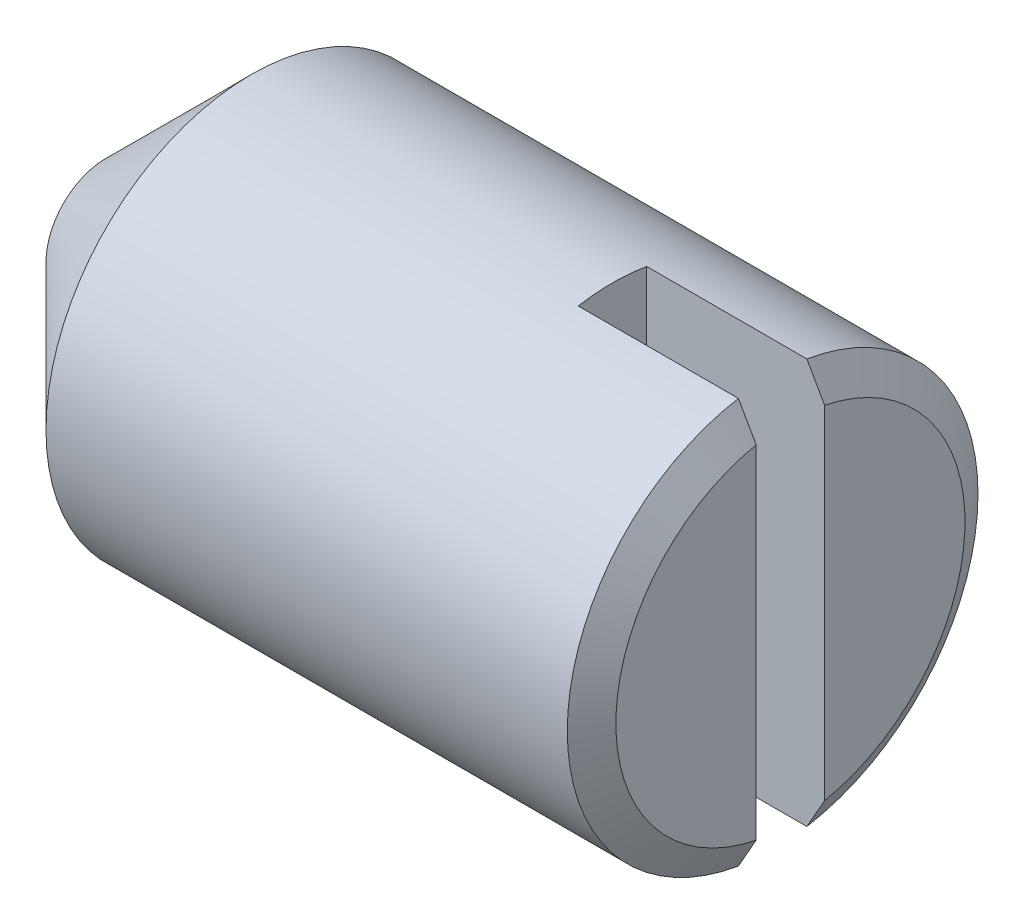
ISO-10303-21;
HEADER;
FILE_DESCRIPTION(('STEP AP214'),'2;1');
FILE_NAME('part.step','',(''),(''),'','','');
FILE_SCHEMA(('AUTOMOTIVE_DESIGN { 1 0 10303 214 1 1 1 1 }'));
ENDSEC;
DATA;
#1=APPLICATION_CONTEXT('core data for automotive mechanical design processes');
#2=APPLICATION_PROTOCOL_DEFINITION('international standard','automotive_design',2000,#1);
#3=PRODUCT_CONTEXT('',#1,'mechanical');
#4=PRODUCT('Part','Part','',(#3));
#5=PRODUCT_RELATED_PRODUCT_CATEGORY('part','',(#4));
#6=PRODUCT_DEFINITION_FORMATION('','',#4);
#7=PRODUCT_DEFINITION_CONTEXT('part definition',#1,'design');
#8=PRODUCT_DEFINITION('design','',#6,#7);
#9=PRODUCT_DEFINITION_SHAPE('','',#8);
#10=(LENGTH_UNIT() NAMED_UNIT(*) SI_UNIT(.MILLI.,.METRE.));
#11=(NAMED_UNIT(*) PLANE_ANGLE_UNIT() SI_UNIT($,.RADIAN.));
#12=(NAMED_UNIT(*) SI_UNIT($,.STERADIAN.) SOLID_ANGLE_UNIT());
#13=UNCERTAINTY_MEASURE_WITH_UNIT(LENGTH_MEASURE(1.E-05),#10,'distance_accuracy_value','');
#14=(GEOMETRIC_REPRESENTATION_CONTEXT(3) GLOBAL_UNCERTAINTY_ASSIGNED_CONTEXT((#13)) GLOBAL_UNIT_ASSIGNED_CONTEXT((#10,
#11,#12)) REPRESENTATION_CONTEXT('',''));
#15=CARTESIAN_POINT('',(0.,0.,0.));
#16=DIRECTION('',(0.,0.,1.));
#17=DIRECTION('',(1.,0.,0.));
#18=AXIS2_PLACEMENT_3D('',#15,#16,#17);
#19=CARTESIAN_POINT('',(2.,0.,-0.50999999999999));
#20=DIRECTION('',(1.,0.,0.));
#21=DIRECTION('',(0.,0.,-1.));
#22=AXIS2_PLACEMENT_3D('',#19,#20,#21);
#23=PLANE('',#22);
#24=DIRECTION('',(0.,-1.,0.));
#25=VECTOR('',#24,1.);
#26=CARTESIAN_POINT('',(2.,0.60000000000001,0.100000000000011));
#27=LINE('',#26,#25);
#28=CARTESIAN_POINT('',(2.,0.500099990001997,0.10000000000001));
#29=VERTEX_POINT('',#28);
#30=CARTESIAN_POINT('',(2.,-0.500099990001997,0.10000000000001));
#31=VERTEX_POINT('',#30);
#32=EDGE_CURVE('E134',#29,#31,#27,.T.);
#33=ORIENTED_EDGE('',*,*,#32,.F.);
#34=CARTESIAN_POINT('',(2.,0.,0.));
#35=DIRECTION('',(1.,0.,0.));
#36=DIRECTION('',(0.,0.,-1.));
#37=AXIS2_PLACEMENT_3D('',#34,#35,#36);
#38=CIRCLE('',#37,0.51);
#39=EDGE_CURVE('E90',#29,#31,#38,.T.);
#40=ORIENTED_EDGE('',*,*,#39,.T.);
#41=EDGE_LOOP('',(#33,#40));
#42=FACE_BOUND('',#41,.T.);
#43=ADVANCED_FACE('F30',(#42),#23,.T.);
#44=CARTESIAN_POINT('',(2.,0.,0.));
#45=DIRECTION('',(-1.,0.,0.));
#46=DIRECTION('',(0.,0.,1.));
#47=AXIS2_PLACEMENT_3D('',#44,#45,#46);
#48=CONICAL_SURFACE('',#47,0.51,1.04719755119662);
#49=CARTESIAN_POINT('',(1.52965892097214,1.32087468389006,0.100000000000008));
#50=CARTESIAN_POINT('',(1.56179693875704,1.26504818730981,0.100000000000008));
#51=CARTESIAN_POINT('',(1.5939282976348,1.2092178517447,0.100000000000008));
#52=CARTESIAN_POINT('',(1.65816453254954,1.09754142647381,0.100000000000009));
#53=CARTESIAN_POINT('',(1.69026940839868,1.04169533666,0.100000000000009));
#54=CARTESIAN_POINT('',(1.75446476448356,0.929935361562991,0.100000000000009));
#55=CARTESIAN_POINT('',(1.78655521258016,0.874021457809743,0.100000000000009));
#56=CARTESIAN_POINT('',(1.85066496904754,0.762153309054091,0.10000000000001));
#57=CARTESIAN_POINT('',(1.88268427783167,0.706199064288594,0.10000000000001));
#58=CARTESIAN_POINT('',(1.94636021742184,0.594619399618778,0.10000000000001));
#59=CARTESIAN_POINT('',(1.97801779761051,0.538994522582253,0.10000000000001));
#60=CARTESIAN_POINT('',(2.02525899152903,0.455433957821876,0.100000000000011));
#61=CARTESIAN_POINT('',(2.04096185923874,0.427565871647886,0.100000000000011));
#62=CARTESIAN_POINT('',(2.07222321786973,0.371750263859073,0.100000000000011));
#63=CARTESIAN_POINT('',(2.08778171373876,0.343802745009668,0.100000000000011));
#64=CARTESIAN_POINT('',(2.11872474974883,0.287599069860201,0.100000000000011));
#65=CARTESIAN_POINT('',(2.13410776620034,0.259342063254484,0.100000000000011));
#66=CARTESIAN_POINT('',(2.15670501663504,0.216680820239872,0.100000000000011));
#67=CARTESIAN_POINT('',(2.16416230951993,0.202405620749689,0.100000000000011));
#68=CARTESIAN_POINT('',(2.17879219505518,0.173710768415212,0.100000000000011));
#69=CARTESIAN_POINT('',(2.18596483829324,0.15929114181403,0.100000000000011));
#70=CARTESIAN_POINT('',(2.199976338519,0.129799900620702,0.100000000000012));
#71=CARTESIAN_POINT('',(2.20680046312372,0.114721286590175,0.100000000000012));
#72=CARTESIAN_POINT('',(2.21929291512398,0.0840633214910501,0.100000000000012));
#73=CARTESIAN_POINT('',(2.22496212934894,0.0684843653471356,0.100000000000012));
#74=CARTESIAN_POINT('',(2.23217499975688,0.04153732600637,0.100000000000012));
#75=CARTESIAN_POINT('',(2.23445536354878,0.0303854725643392,0.100000000000012));
#76=CARTESIAN_POINT('',(2.23687462280647,0.00790620454751713,0.100000000000012));
#77=CARTESIAN_POINT('',(2.23702992329215,-0.00341918861119514,0.100000000000012));
#78=CARTESIAN_POINT('',(2.2349139766279,-0.0289009752850584,0.100000000000012));
#79=CARTESIAN_POINT('',(2.2319741755273,-0.042993408705177,0.100000000000012));
#80=CARTESIAN_POINT('',(2.22408862768613,-0.0707394022678717,0.100000000000012));
#81=CARTESIAN_POINT('',(2.21911402674264,-0.0843834648220622,0.100000000000012));
#82=CARTESIAN_POINT('',(2.207712395851,-0.112596986023548,0.100000000000012));
#83=CARTESIAN_POINT('',(2.20119106926416,-0.127127058161028,0.100000000000012));
#84=CARTESIAN_POINT('',(2.18760359816218,-0.155933288379643,0.100000000000011));
#85=CARTESIAN_POINT('',(2.18053713839328,-0.170209293570216,0.100000000000011));
#86=CARTESIAN_POINT('',(2.15889775808945,-0.212864110493062,0.100000000000011));
#87=CARTESIAN_POINT('',(2.14390407373086,-0.241027785795669,0.100000000000011));
#88=CARTESIAN_POINT('',(2.11360531723462,-0.296981402510075,0.100000000000011));
#89=CARTESIAN_POINT('',(2.09830241369279,-0.324772547829015,0.100000000000011));
#90=CARTESIAN_POINT('',(2.06750728677705,-0.380216309212636,0.100000000000011));
#91=CARTESIAN_POINT('',(2.05201525404092,-0.407869030603945,0.100000000000011));
#92=CARTESIAN_POINT('',(1.99488290317961,-0.509413579951416,0.10000000000001));
#93=CARTESIAN_POINT('',(1.95293267220556,-0.583130166111844,0.10000000000001));
#94=CARTESIAN_POINT('',(1.86881243308394,-0.730478351664121,0.10000000000001));
#95=CARTESIAN_POINT('',(1.82664234001035,-0.804109902342284,0.10000000000001));
#96=CARTESIAN_POINT('',(1.7420227381237,-0.951629614377002,0.100000000000009));
#97=CARTESIAN_POINT('',(1.69957280438184,-1.02551753221252,0.100000000000009));
#98=CARTESIAN_POINT('',(1.61463648322268,-1.17322947530776,0.100000000000008));
#99=CARTESIAN_POINT('',(1.5721501198294,-1.24705351437835,0.100000000000008));
#100=CARTESIAN_POINT('',(1.52965892097214,-1.32087468389006,0.100000000000008));
#101=B_SPLINE_CURVE_WITH_KNOTS('',3,(#49,#50,#51,#52,#53,#54,#55,#56,#57,#58,#59,#60,#61,#62,
#63,#64,#65,#66,#67,#68,#69,#70,#71,#72,#73,#74,#75,#76,#77,#78,#79,#80,#81,#82,#83,#84,#85,#86,
#87,#88,#89,#90,#91,#92,#93,#94,#95,#96,#97,#98,#99,#100),.UNSPECIFIED.,.F.,.F.,(4,2,2,2,2,2,2,
2,2,2,2,2,2,2,2,2,2,2,2,2,2,2,2,2,2,4),(0.,0.193248677871487,0.386498714868409,
0.579903573700656,0.773307305840194,0.965314591174495,1.06127717063602,1.15723644914851,
1.2537499493799,1.30206593249576,1.3503732901272,1.40001763853746,1.44962372128501,
1.48363196848161,1.51737753007634,1.56026214588704,1.60377721165472,1.65153270726165,
1.69931603022697,1.79502096839395,1.89019904643225,1.98528802573422,2.23973826052656,
2.49429539150074,2.74993724242732,3.00546742257635),.UNSPECIFIED.);
#102=CARTESIAN_POINT('',(1.94803847577293,0.591607978309968,0.10000000000001));
#103=VERTEX_POINT('',#102);
#104=EDGE_CURVE('E137',#103,#29,#101,.T.);
#105=ORIENTED_EDGE('',*,*,#104,.F.);
#106=CARTESIAN_POINT('',(1.94803847577293,0.,0.));
#107=DIRECTION('',(1.,0.,0.));
#108=DIRECTION('',(0.,0.,-1.));
#109=AXIS2_PLACEMENT_3D('',#106,#107,#108);
#110=CIRCLE('',#109,0.60000000000001);
#111=CARTESIAN_POINT('',(1.94803847577293,-0.591607978309968,0.10000000000001));
#112=VERTEX_POINT('',#111);
#113=EDGE_CURVE('E102',#103,#112,#110,.T.);
#114=ORIENTED_EDGE('',*,*,#113,.T.);
#115=EDGE_CURVE('E52',#31,#112,#101,.T.);
#116=ORIENTED_EDGE('',*,*,#115,.F.);
#117=ORIENTED_EDGE('',*,*,#39,.F.);
#118=EDGE_LOOP('',(#105,#114,#116,#117));
#119=FACE_BOUND('',#118,.T.);
#120=ADVANCED_FACE('F136',(#119),#48,.T.);
#121=DIRECTION('',(0.,1.,0.));
#122=VECTOR('',#121,1.);
#123=CARTESIAN_POINT('',(2.,0.60000000000001,-0.0999999999999895));
#124=LINE('',#123,#122);
#125=CARTESIAN_POINT('',(2.,-0.500099990001997,-0.0999999999999894));
#126=VERTEX_POINT('',#125);
#127=CARTESIAN_POINT('',(2.,0.500099990001997,-0.0999999999999894));
#128=VERTEX_POINT('',#127);
#129=EDGE_CURVE('E96',#126,#128,#124,.T.);
#130=ORIENTED_EDGE('',*,*,#129,.F.);
#131=EDGE_CURVE('E119',#126,#128,#38,.T.);
#132=ORIENTED_EDGE('',*,*,#131,.T.);
#133=EDGE_LOOP('',(#130,#132));
#134=FACE_BOUND('',#133,.T.);
#135=ADVANCED_FACE('F32',(#134),#23,.T.);
#136=CARTESIAN_POINT('',(1.52965892097214,-1.32087468389006,-0.099999999999992));
#137=CARTESIAN_POINT('',(1.56179693875704,-1.2650481873098,-0.0999999999999918));
#138=CARTESIAN_POINT('',(1.5939282976348,-1.2092178517447,-0.0999999999999916));
#139=CARTESIAN_POINT('',(1.65816453254954,-1.09754142647381,-0.0999999999999913));
#140=CARTESIAN_POINT('',(1.69026940839869,-1.04169533666,-0.0999999999999911));
#141=CARTESIAN_POINT('',(1.75446476448356,-0.92993536156299,-0.0999999999999908));
#142=CARTESIAN_POINT('',(1.78655521258016,-0.874021457809743,-0.0999999999999906));
#143=CARTESIAN_POINT('',(1.85066496904755,-0.76215330905409,-0.0999999999999903));
#144=CARTESIAN_POINT('',(1.88268427783167,-0.706199064288593,-0.0999999999999901));
#145=CARTESIAN_POINT('',(1.94636021742184,-0.594619399618777,-0.0999999999999898));
#146=CARTESIAN_POINT('',(1.97801779761052,-0.538994522582252,-0.0999999999999896));
#147=CARTESIAN_POINT('',(2.02525899152903,-0.455433957821875,-0.0999999999999893));
#148=CARTESIAN_POINT('',(2.04096185923874,-0.427565871647886,-0.0999999999999893));
#149=CARTESIAN_POINT('',(2.07222321786973,-0.371750263859072,-0.0999999999999891));
#150=CARTESIAN_POINT('',(2.08778171373876,-0.343802745009667,-0.099999999999989));
#151=CARTESIAN_POINT('',(2.11872474974884,-0.2875990698602,-0.0999999999999888));
#152=CARTESIAN_POINT('',(2.13410776620034,-0.259342063254484,-0.0999999999999888));
#153=CARTESIAN_POINT('',(2.15670501663504,-0.216680820239872,-0.0999999999999887));
#154=CARTESIAN_POINT('',(2.16416230951993,-0.202405620749689,-0.0999999999999886));
#155=CARTESIAN_POINT('',(2.17879219505519,-0.173710768415212,-0.0999999999999885));
#156=CARTESIAN_POINT('',(2.18596483829324,-0.15929114181403,-0.0999999999999885));
#157=CARTESIAN_POINT('',(2.199976338519,-0.129799900620702,-0.0999999999999884));
#158=CARTESIAN_POINT('',(2.20680046312372,-0.114721286590175,-0.0999999999999884));
#159=CARTESIAN_POINT('',(2.21929291512398,-0.0840633214910501,-0.0999999999999883));
#160=CARTESIAN_POINT('',(2.22496212934894,-0.0684843653471355,-0.0999999999999883));
#161=CARTESIAN_POINT('',(2.23217499975688,-0.0415373260063699,-0.0999999999999883));
#162=CARTESIAN_POINT('',(2.23445536354878,-0.0303854725643393,-0.0999999999999882));
#163=CARTESIAN_POINT('',(2.23687462280647,-0.00790620454751715,-0.0999999999999882));
#164=CARTESIAN_POINT('',(2.23702992329215,0.00341918861119521,-0.0999999999999882));
#165=CARTESIAN_POINT('',(2.23491397662791,0.0289009752850585,-0.0999999999999882));
#166=CARTESIAN_POINT('',(2.2319741755273,0.0429934087051771,-0.0999999999999883));
#167=CARTESIAN_POINT('',(2.22408862768613,0.0707394022678719,-0.0999999999999883));
#168=CARTESIAN_POINT('',(2.21911402674264,0.0843834648220625,-0.0999999999999883));
#169=CARTESIAN_POINT('',(2.207712395851,0.112596986023549,-0.0999999999999884));
#170=CARTESIAN_POINT('',(2.20119106926416,0.127127058161029,-0.0999999999999884));
#171=CARTESIAN_POINT('',(2.18760359816218,0.155933288379643,-0.0999999999999885));
#172=CARTESIAN_POINT('',(2.18053713839328,0.170209293570216,-0.0999999999999885));
#173=CARTESIAN_POINT('',(2.15889775808945,0.212864110493063,-0.0999999999999886));
#174=CARTESIAN_POINT('',(2.14390407373086,0.24102778579567,-0.0999999999999887));
#175=CARTESIAN_POINT('',(2.11360531723462,0.296981402510076,-0.0999999999999889));
#176=CARTESIAN_POINT('',(2.09830241369279,0.324772547829016,-0.099999999999989));
#177=CARTESIAN_POINT('',(2.06750728677705,0.380216309212637,-0.0999999999999891));
#178=CARTESIAN_POINT('',(2.05201525404092,0.407869030603946,-0.0999999999999892));
#179=CARTESIAN_POINT('',(1.99488290317961,0.509413579951416,-0.0999999999999895));
#180=CARTESIAN_POINT('',(1.95293267220556,0.583130166111844,-0.0999999999999897));
#181=CARTESIAN_POINT('',(1.86881243308394,0.73047835166412,-0.0999999999999902));
#182=CARTESIAN_POINT('',(1.82664234001035,0.804109902342283,-0.0999999999999904));
#183=CARTESIAN_POINT('',(1.7420227381237,0.951629614377001,-0.0999999999999908));
#184=CARTESIAN_POINT('',(1.69957280438184,1.02551753221252,-0.0999999999999911));
#185=CARTESIAN_POINT('',(1.61463648322268,1.17322947530776,-0.0999999999999915));
#186=CARTESIAN_POINT('',(1.5721501198294,1.24705351437835,-0.0999999999999917));
#187=CARTESIAN_POINT('',(1.52965892097214,1.32087468389006,-0.099999999999992));
#188=B_SPLINE_CURVE_WITH_KNOTS('',3,(#136,#137,#138,#139,#140,#141,#142,#143,#144,#145,#146,
#147,#148,#149,#150,#151,#152,#153,#154,#155,#156,#157,#158,#159,#160,#161,#162,#163,#164,#165,
#166,#167,#168,#169,#170,#171,#172,#173,#174,#175,#176,#177,#178,#179,#180,#181,#182,#183,#184,
#185,#186,#187),.UNSPECIFIED.,.F.,.F.,(4,2,2,2,2,2,2,2,2,2,2,2,2,2,2,2,2,2,2,2,2,2,2,2,2,4),(0.,
0.193248677871488,0.38649871486841,0.579903573700657,0.773307305840194,0.965314591174495,
1.06127717063602,1.15723644914851,1.2537499493799,1.30206593249576,1.3503732901272,
1.40001763853746,1.44962372128501,1.48363196848161,1.51737753007634,1.56026214588704,
1.60377721165472,1.65153270726165,1.69931603022697,1.79502096839395,1.89019904643225,
1.98528802573422,2.23973826052656,2.49429539150074,2.74993724242732,3.00546742257635),.UNSPECIFIED.);
#189=CARTESIAN_POINT('',(1.94803847577293,-0.591607978309968,-0.0999999999999897));
#190=VERTEX_POINT('',#189);
#191=EDGE_CURVE('E109',#190,#126,#188,.T.);
#192=ORIENTED_EDGE('',*,*,#191,.F.);
#193=CARTESIAN_POINT('',(1.94803847577293,0.591607978309968,-0.0999999999999897));
#194=VERTEX_POINT('',#193);
#195=EDGE_CURVE('E117',#190,#194,#110,.T.);
#196=ORIENTED_EDGE('',*,*,#195,.T.);
#197=EDGE_CURVE('E120',#128,#194,#188,.T.);
#198=ORIENTED_EDGE('',*,*,#197,.F.);
#199=ORIENTED_EDGE('',*,*,#131,.F.);
#200=EDGE_LOOP('',(#192,#196,#198,#199));
#201=FACE_BOUND('',#200,.T.);
#202=ADVANCED_FACE('F115',(#201),#48,.T.);
#203=CARTESIAN_POINT('',(2.,0.,0.));
#204=DIRECTION('',(1.,0.,0.));
#205=DIRECTION('',(0.,0.,-1.));
#206=AXIS2_PLACEMENT_3D('',#203,#204,#205);
#207=CYLINDRICAL_SURFACE('',#206,0.600000000000006);
#208=DIRECTION('',(1.,0.,0.));
#209=VECTOR('',#208,1.);
#210=CARTESIAN_POINT('',(2.,-0.591607978309968,0.100000000000011));
#211=LINE('',#210,#209);
#212=CARTESIAN_POINT('',(1.48,-0.591607978309967,0.100000000000008));
#213=VERTEX_POINT('',#212);
#214=EDGE_CURVE('E12',#112,#213,#211,.F.);
#215=ORIENTED_EDGE('',*,*,#214,.F.);
#216=ORIENTED_EDGE('',*,*,#113,.F.);
#217=DIRECTION('',(1.,0.,0.));
#218=VECTOR('',#217,1.);
#219=CARTESIAN_POINT('',(2.,0.591607978309968,0.100000000000011));
#220=LINE('',#219,#218);
#221=CARTESIAN_POINT('',(1.48,0.591607978309967,0.100000000000008));
#222=VERTEX_POINT('',#221);
#223=EDGE_CURVE('E94',#222,#103,#220,.T.);
#224=ORIENTED_EDGE('',*,*,#223,.F.);
#225=CARTESIAN_POINT('',(1.48,0.,0.));
#226=DIRECTION('',(1.,0.,0.));
#227=DIRECTION('',(0.,0.,-1.));
#228=AXIS2_PLACEMENT_3D('',#225,#226,#227);
#229=CIRCLE('',#228,0.600000000000006);
#230=CARTESIAN_POINT('',(1.48,0.591607978309967,-0.0999999999999922));
#231=VERTEX_POINT('',#230);
#232=EDGE_CURVE('E81',#222,#231,#229,.F.);
#233=ORIENTED_EDGE('',*,*,#232,.T.);
#234=DIRECTION('',(1.,0.,0.));
#235=VECTOR('',#234,1.);
#236=CARTESIAN_POINT('',(2.,0.591607978309968,-0.0999999999999895));
#237=LINE('',#236,#235);
#238=EDGE_CURVE('E89',#194,#231,#237,.F.);
#239=ORIENTED_EDGE('',*,*,#238,.F.);
#240=ORIENTED_EDGE('',*,*,#195,.F.);
#241=DIRECTION('',(1.,0.,0.));
#242=VECTOR('',#241,1.);
#243=CARTESIAN_POINT('',(2.,-0.591607978309968,-0.0999999999999895));
#244=LINE('',#243,#242);
#245=CARTESIAN_POINT('',(1.48,-0.591607978309967,-0.0999999999999922));
#246=VERTEX_POINT('',#245);
#247=EDGE_CURVE('E38',#246,#190,#244,.T.);
#248=ORIENTED_EDGE('',*,*,#247,.F.);
#249=EDGE_CURVE('E92',#246,#213,#229,.F.);
#250=ORIENTED_EDGE('',*,*,#249,.T.);
#251=EDGE_LOOP('',(#215,#216,#224,#233,#239,#240,#248,#250));
#252=FACE_BOUND('',#251,.T.);
#253=CARTESIAN_POINT('',(0.425000000000001,0.,0.));
#254=DIRECTION('',(1.,0.,0.));
#255=DIRECTION('',(0.,0.,-1.));
#256=AXIS2_PLACEMENT_3D('',#253,#254,#255);
#257=CIRCLE('',#256,0.600000000000002);
#258=CARTESIAN_POINT('',(0.425000000000004,0.,-0.6));
#259=VERTEX_POINT('',#258);
#260=EDGE_CURVE('E122',#259,#259,#257,.T.);
#261=ORIENTED_EDGE('',*,*,#260,.T.);
#262=EDGE_LOOP('',(#261));
#263=FACE_BOUND('',#262,.T.);
#264=ADVANCED_FACE('F99',(#252,#263),#207,.T.);
#265=CARTESIAN_POINT('',(0.425000000000001,0.,0.));
#266=DIRECTION('',(1.,0.,0.));
#267=DIRECTION('',(0.,0.,-1.));
#268=AXIS2_PLACEMENT_3D('',#265,#266,#267);
#269=CONICAL_SURFACE('',#268,0.600000000000002,0.785398163397463);
#270=CARTESIAN_POINT('',(0.,0.,0.));
#271=DIRECTION('',(1.,0.,0.));
#272=DIRECTION('',(0.,0.,-1.));
#273=AXIS2_PLACEMENT_3D('',#270,#271,#272);
#274=CIRCLE('',#273,0.174999999999988);
#275=CARTESIAN_POINT('',(0.,0.,-0.174999999999988));
#276=VERTEX_POINT('',#275);
#277=EDGE_CURVE('E125',#276,#276,#274,.T.);
#278=CARTESIAN_POINT('',(0.,0.,-0.174999999999988));
#279=CARTESIAN_POINT('',(0.00442708333333341,0.,-0.179427083333321));
#280=CARTESIAN_POINT('',(0.00885416666666678,0.,-0.183854166666655));
#281=CARTESIAN_POINT('',(0.0177083333333335,0.,-0.192708333333321));
#282=CARTESIAN_POINT('',(0.0221354166666669,0.,-0.197135416666655));
#283=CARTESIAN_POINT('',(0.0309895833333337,0.,-0.205989583333322));
#284=CARTESIAN_POINT('',(0.0354166666666671,0.,-0.210416666666655));
#285=CARTESIAN_POINT('',(0.0442708333333338,0.,-0.219270833333322));
#286=CARTESIAN_POINT('',(0.0486979166666672,0.,-0.223697916666656));
#287=CARTESIAN_POINT('',(0.057552083333334,0.,-0.232552083333323));
#288=CARTESIAN_POINT('',(0.0619791666666673,0.,-0.236979166666656));
#289=CARTESIAN_POINT('',(0.0708333333333341,0.,-0.245833333333323));
#290=CARTESIAN_POINT('',(0.0752604166666675,0.,-0.250260416666656));
#291=CARTESIAN_POINT('',(0.0841145833333343,0.,-0.259114583333323));
#292=CARTESIAN_POINT('',(0.0885416666666676,0.,-0.263541666666657));
#293=CARTESIAN_POINT('',(0.0973958333333343,0.,-0.272395833333324));
#294=CARTESIAN_POINT('',(0.101822916666668,0.,-0.276822916666657));
#295=CARTESIAN_POINT('',(0.110677083333334,0.,-0.285677083333324));
#296=CARTESIAN_POINT('',(0.115104166666668,0.,-0.290104166666658));
#297=CARTESIAN_POINT('',(0.123958333333335,0.,-0.298958333333325));
#298=CARTESIAN_POINT('',(0.128385416666668,0.,-0.303385416666658));
#299=CARTESIAN_POINT('',(0.137239583333335,0.,-0.312239583333325));
#300=CARTESIAN_POINT('',(0.141666666666668,0.,-0.316666666666658));
#301=CARTESIAN_POINT('',(0.150520833333335,0.,-0.325520833333325));
#302=CARTESIAN_POINT('',(0.154947916666668,0.,-0.329947916666659));
#303=CARTESIAN_POINT('',(0.163802083333335,0.,-0.338802083333326));
#304=CARTESIAN_POINT('',(0.168229166666668,0.,-0.343229166666659));
#305=CARTESIAN_POINT('',(0.177083333333335,0.,-0.352083333333326));
#306=CARTESIAN_POINT('',(0.181510416666669,0.,-0.35651041666666));
#307=CARTESIAN_POINT('',(0.190364583333335,0.,-0.365364583333326));
#308=CARTESIAN_POINT('',(0.194791666666669,0.,-0.36979166666666));
#309=CARTESIAN_POINT('',(0.203645833333335,0.,-0.378645833333327));
#310=CARTESIAN_POINT('',(0.208072916666669,0.,-0.38307291666666));
#311=CARTESIAN_POINT('',(0.216927083333336,0.,-0.391927083333327));
#312=CARTESIAN_POINT('',(0.221354166666669,0.,-0.396354166666661));
#313=CARTESIAN_POINT('',(0.230208333333336,0.,-0.405208333333328));
#314=CARTESIAN_POINT('',(0.234635416666669,0.,-0.409635416666661));
#315=CARTESIAN_POINT('',(0.243489583333336,0.,-0.418489583333328));
#316=CARTESIAN_POINT('',(0.247916666666669,0.,-0.422916666666661));
#317=CARTESIAN_POINT('',(0.256770833333336,0.,-0.431770833333328));
#318=CARTESIAN_POINT('',(0.261197916666669,0.,-0.436197916666662));
#319=CARTESIAN_POINT('',(0.270052083333336,0.,-0.445052083333329));
#320=CARTESIAN_POINT('',(0.274479166666669,0.,-0.449479166666662));
#321=CARTESIAN_POINT('',(0.283333333333336,0.,-0.458333333333329));
#322=CARTESIAN_POINT('',(0.28776041666667,0.,-0.462760416666663));
#323=CARTESIAN_POINT('',(0.296614583333336,0.,-0.47161458333333));
#324=CARTESIAN_POINT('',(0.30104166666667,0.,-0.476041666666663));
#325=CARTESIAN_POINT('',(0.309895833333337,0.,-0.48489583333333));
#326=CARTESIAN_POINT('',(0.31432291666667,0.,-0.489322916666663));
#327=CARTESIAN_POINT('',(0.323177083333337,0.,-0.49817708333333));
#328=CARTESIAN_POINT('',(0.32760416666667,0.,-0.502604166666664));
#329=CARTESIAN_POINT('',(0.336458333333337,0.,-0.511458333333331));
#330=CARTESIAN_POINT('',(0.34088541666667,0.,-0.515885416666664));
#331=CARTESIAN_POINT('',(0.349739583333337,0.,-0.524739583333331));
#332=CARTESIAN_POINT('',(0.35416666666667,0.,-0.529166666666664));
#333=CARTESIAN_POINT('',(0.363020833333337,0.,-0.538020833333331));
#334=CARTESIAN_POINT('',(0.36744791666667,0.,-0.542447916666665));
#335=CARTESIAN_POINT('',(0.376302083333337,0.,-0.551302083333332));
#336=CARTESIAN_POINT('',(0.380729166666671,0.,-0.555729166666665));
#337=CARTESIAN_POINT('',(0.389583333333337,0.,-0.564583333333332));
#338=CARTESIAN_POINT('',(0.394010416666671,0.,-0.569010416666666));
#339=CARTESIAN_POINT('',(0.402864583333337,0.,-0.577864583333332));
#340=CARTESIAN_POINT('',(0.407291666666671,0.,-0.582291666666666));
#341=CARTESIAN_POINT('',(0.416145833333338,0.,-0.591145833333333));
#342=CARTESIAN_POINT('',(0.420572916666671,0.,-0.595572916666666));
#343=CARTESIAN_POINT('',(0.425000000000004,0.,-0.6));
#344=B_SPLINE_CURVE_WITH_KNOTS('',3,(#278,#279,#280,#281,#282,#283,#284,#285,#286,#287,#288,
#289,#290,#291,#292,#293,#294,#295,#296,#297,#298,#299,#300,#301,#302,#303,#304,#305,#306,#307,
#308,#309,#310,#311,#312,#313,#314,#315,#316,#317,#318,#319,#320,#321,#322,#323,#324,#325,#326,
#327,#328,#329,#330,#331,#332,#333,#334,#335,#336,#337,#338,#339,#340,#341,#342,#343),
.UNSPECIFIED.,.F.,.F.,(4,2,2,2,2,2,2,2,2,2,2,2,2,2,2,2,2,2,2,2,2,2,2,2,2,2,2,2,2,2,2,2,4),(0.,
0.018782523875268,0.0375650477505361,0.0563475716258041,0.0751300955010721,0.0939126193763402,
0.112695143251608,0.131477667126876,0.150260191002144,0.169042714877412,0.18782523875268,
0.206607762627948,0.225390286503216,0.244172810378484,0.262955334253752,0.281737858129021,
0.300520382004289,0.319302905879557,0.338085429754825,0.356867953630093,0.375650477505361,
0.394433001380629,0.413215525255897,0.431998049131165,0.450780573006433,0.469563096881701,
0.488345620756969,0.507128144632237,0.525910668507505,0.544693192382773,0.563475716258041,
0.582258240133309,0.601040764008577),.UNSPECIFIED.);
#345=EDGE_CURVE('BSEAM159',#276,#259,#344,.T.);
#346=ORIENTED_EDGE('',*,*,#277,.T.);
#347=ORIENTED_EDGE('',*,*,#260,.F.);
#348=ORIENTED_EDGE('',*,*,#345,.T.);
#349=ORIENTED_EDGE('',*,*,#345,.F.);
#350=EDGE_LOOP('',(#346,#348,#347,#349));
#351=FACE_BOUND('',#350,.T.);
#352=ADVANCED_FACE('F159',(#351),#269,.T.);
#353=CARTESIAN_POINT('',(0.,0.,0.));
#354=DIRECTION('',(-1.,0.,0.));
#355=DIRECTION('',(0.,0.,1.));
#356=AXIS2_PLACEMENT_3D('',#353,#354,#355);
#357=PLANE('',#356);
#358=ORIENTED_EDGE('',*,*,#277,.F.);
#359=EDGE_LOOP('',(#358));
#360=FACE_BOUND('',#359,.T.);
#361=ADVANCED_FACE('F154',(#360),#357,.T.);
#362=CARTESIAN_POINT('',(1.48,0.60000000000001,0.100000000000008));
#363=DIRECTION('',(0.,0.,1.));
#364=DIRECTION('',(1.,0.,0.));
#365=AXIS2_PLACEMENT_3D('',#362,#363,#364);
#366=PLANE('',#365);
#367=ORIENTED_EDGE('',*,*,#115,.T.);
#368=ORIENTED_EDGE('',*,*,#214,.T.);
#369=DIRECTION('',(0.,-1.,0.));
#370=VECTOR('',#369,1.);
#371=CARTESIAN_POINT('',(1.48,0.60000000000001,0.100000000000008));
#372=LINE('',#371,#370);
#373=EDGE_CURVE('E84',#222,#213,#372,.T.);
#374=ORIENTED_EDGE('',*,*,#373,.F.);
#375=ORIENTED_EDGE('',*,*,#223,.T.);
#376=ORIENTED_EDGE('',*,*,#104,.T.);
#377=ORIENTED_EDGE('',*,*,#32,.T.);
#378=EDGE_LOOP('',(#367,#368,#374,#375,#376,#377));
#379=FACE_BOUND('',#378,.T.);
#380=ADVANCED_FACE('F93',(#379),#366,.F.);
#381=CARTESIAN_POINT('',(1.48,0.60000000000001,-0.0999999999999922));
#382=DIRECTION('',(0.,0.,-1.));
#383=DIRECTION('',(-1.,0.,0.));
#384=AXIS2_PLACEMENT_3D('',#381,#382,#383);
#385=PLANE('',#384);
#386=ORIENTED_EDGE('',*,*,#197,.T.);
#387=ORIENTED_EDGE('',*,*,#238,.T.);
#388=DIRECTION('',(0.,1.,0.));
#389=VECTOR('',#388,1.);
#390=CARTESIAN_POINT('',(1.48,0.60000000000001,-0.0999999999999922));
#391=LINE('',#390,#389);
#392=EDGE_CURVE('E45',#246,#231,#391,.T.);
#393=ORIENTED_EDGE('',*,*,#392,.F.);
#394=ORIENTED_EDGE('',*,*,#247,.T.);
#395=ORIENTED_EDGE('',*,*,#191,.T.);
#396=ORIENTED_EDGE('',*,*,#129,.T.);
#397=EDGE_LOOP('',(#386,#387,#393,#394,#395,#396));
#398=FACE_BOUND('',#397,.T.);
#399=ADVANCED_FACE('F108',(#398),#385,.F.);
#400=CARTESIAN_POINT('',(1.48,-0.60000000000001,0.100000000000008));
#401=DIRECTION('',(1.,0.,0.));
#402=DIRECTION('',(0.,0.,-1.));
#403=AXIS2_PLACEMENT_3D('',#400,#401,#402);
#404=PLANE('',#403);
#405=ORIENTED_EDGE('',*,*,#392,.T.);
#406=ORIENTED_EDGE('',*,*,#232,.F.);
#407=ORIENTED_EDGE('',*,*,#373,.T.);
#408=ORIENTED_EDGE('',*,*,#249,.F.);
#409=EDGE_LOOP('',(#405,#406,#407,#408));
#410=FACE_BOUND('',#409,.T.);
#411=ADVANCED_FACE('F83',(#410),#404,.T.);
#412=CLOSED_SHELL('',(#43,#120,#135,#202,#264,#352,#361,#380,#399,#411));
#413=MANIFOLD_SOLID_BREP('B2',#412);
#414=ADVANCED_BREP_SHAPE_REPRESENTATION('',(#18,#413),#14);
#415=SHAPE_DEFINITION_REPRESENTATION(#9,#414);
ENDSEC;
END-ISO-10303-21;
